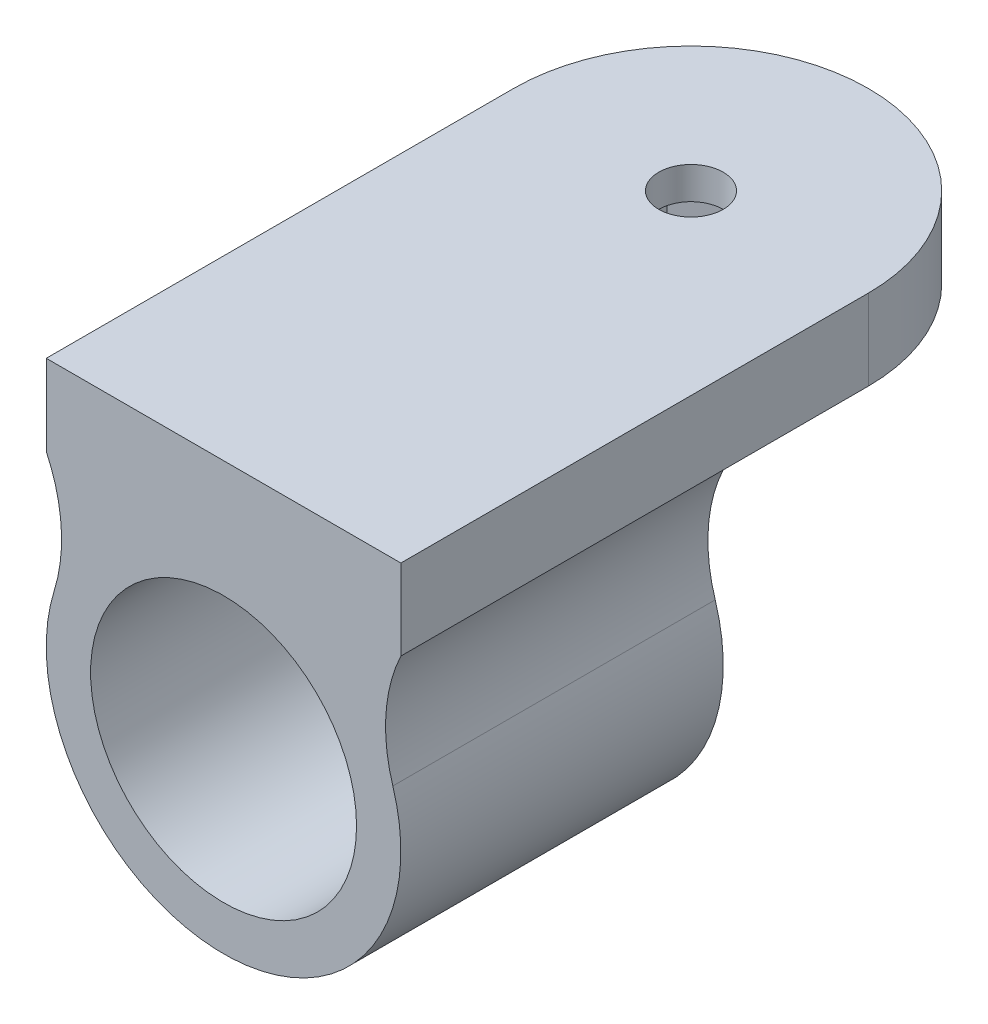
ISO-10303-21;
HEADER;
FILE_DESCRIPTION(('STEP AP214'),'2;1');
FILE_NAME('part.step','',(''),(''),'','','');
FILE_SCHEMA(('AUTOMOTIVE_DESIGN { 1 0 10303 214 1 1 1 1 }'));
ENDSEC;
DATA;
#1=APPLICATION_CONTEXT('core data for automotive mechanical design processes');
#2=APPLICATION_PROTOCOL_DEFINITION('international standard','automotive_design',2000,#1);
#3=PRODUCT_CONTEXT('',#1,'mechanical');
#4=PRODUCT('Part','Part','',(#3));
#5=PRODUCT_RELATED_PRODUCT_CATEGORY('part','',(#4));
#6=PRODUCT_DEFINITION_FORMATION('','',#4);
#7=PRODUCT_DEFINITION_CONTEXT('part definition',#1,'design');
#8=PRODUCT_DEFINITION('design','',#6,#7);
#9=PRODUCT_DEFINITION_SHAPE('','',#8);
#10=(LENGTH_UNIT() NAMED_UNIT(*) SI_UNIT(.MILLI.,.METRE.));
#11=(NAMED_UNIT(*) PLANE_ANGLE_UNIT() SI_UNIT($,.RADIAN.));
#12=(NAMED_UNIT(*) SI_UNIT($,.STERADIAN.) SOLID_ANGLE_UNIT());
#13=UNCERTAINTY_MEASURE_WITH_UNIT(LENGTH_MEASURE(1.E-05),#10,'distance_accuracy_value','');
#14=(GEOMETRIC_REPRESENTATION_CONTEXT(3) GLOBAL_UNCERTAINTY_ASSIGNED_CONTEXT((#13)) GLOBAL_UNIT_ASSIGNED_CONTEXT((#10,
#11,#12)) REPRESENTATION_CONTEXT('',''));
#15=CARTESIAN_POINT('',(0.,0.,0.));
#16=DIRECTION('',(0.,0.,1.));
#17=DIRECTION('',(1.,0.,0.));
#18=AXIS2_PLACEMENT_3D('',#15,#16,#17);
#19=CARTESIAN_POINT('',(0.,15.5,-9.));
#20=DIRECTION('',(0.,-1.,0.));
#21=DIRECTION('',(0.,0.,-1.));
#22=AXIS2_PLACEMENT_3D('',#19,#20,#21);
#23=CYLINDRICAL_SURFACE('',#22,2.);
#24=CARTESIAN_POINT('',(0.,15.5,-9.));
#25=DIRECTION('',(0.,-1.,0.));
#26=DIRECTION('',(0.,0.,-1.));
#27=AXIS2_PLACEMENT_3D('',#24,#25,#26);
#28=CIRCLE('',#27,2.);
#29=CARTESIAN_POINT('',(0.,15.5,-11.));
#30=VERTEX_POINT('',#29);
#31=EDGE_CURVE('E225',#30,#30,#28,.T.);
#32=ORIENTED_EDGE('',*,*,#31,.F.);
#33=EDGE_LOOP('',(#32));
#34=FACE_BOUND('',#33,.T.);
#35=CARTESIAN_POINT('',(0.,13.5,-9.));
#36=DIRECTION('',(0.,-1.,0.));
#37=DIRECTION('',(0.,0.,-1.));
#38=AXIS2_PLACEMENT_3D('',#35,#36,#37);
#39=CIRCLE('',#38,2.);
#40=CARTESIAN_POINT('',(0.,13.5,-11.));
#41=VERTEX_POINT('',#40);
#42=EDGE_CURVE('E47',#41,#41,#39,.F.);
#43=ORIENTED_EDGE('',*,*,#42,.F.);
#44=EDGE_LOOP('',(#43));
#45=FACE_BOUND('',#44,.T.);
#46=ADVANCED_FACE('F43',(#34,#45),#23,.F.);
#47=CARTESIAN_POINT('',(0.,0.,20.));
#48=DIRECTION('',(0.,0.,1.));
#49=DIRECTION('',(1.,0.,0.));
#50=AXIS2_PLACEMENT_3D('',#47,#48,#49);
#51=PLANE('',#50);
#52=DIRECTION('',(0.,-1.,0.));
#53=VECTOR('',#52,1.);
#54=CARTESIAN_POINT('',(-11.,15.5,20.));
#55=LINE('',#54,#53);
#56=CARTESIAN_POINT('',(-11.,15.5,20.));
#57=VERTEX_POINT('',#56);
#58=CARTESIAN_POINT('',(-11.,10.5,20.));
#59=VERTEX_POINT('',#58);
#60=EDGE_CURVE('E252',#57,#59,#55,.T.);
#61=ORIENTED_EDGE('',*,*,#60,.T.);
#62=CARTESIAN_POINT('',(-20.0497964461891,6.24545134208765,20.));
#63=DIRECTION('',(0.,0.,1.));
#64=DIRECTION('',(1.,0.,0.));
#65=AXIS2_PLACEMENT_3D('',#62,#63,#64);
#66=CIRCLE('',#65,10.);
#67=CARTESIAN_POINT('',(-10.5022743289562,3.27142689347448,20.));
#68=VERTEX_POINT('',#67);
#69=EDGE_CURVE('E53',#59,#68,#66,.F.);
#70=ORIENTED_EDGE('',*,*,#69,.T.);
#71=CARTESIAN_POINT('',(0.,0.,20.));
#72=DIRECTION('',(0.,0.,1.));
#73=DIRECTION('',(1.,0.,0.));
#74=AXIS2_PLACEMENT_3D('',#71,#72,#73);
#75=CIRCLE('',#74,11.);
#76=CARTESIAN_POINT('',(10.5022743289562,3.27142689347448,20.));
#77=VERTEX_POINT('',#76);
#78=EDGE_CURVE('E267',#68,#77,#75,.T.);
#79=ORIENTED_EDGE('',*,*,#78,.T.);
#80=CARTESIAN_POINT('',(20.0497964461891,6.24545134208765,20.));
#81=DIRECTION('',(0.,0.,1.));
#82=DIRECTION('',(1.,0.,0.));
#83=AXIS2_PLACEMENT_3D('',#80,#81,#82);
#84=CIRCLE('',#83,10.);
#85=CARTESIAN_POINT('',(11.,10.5,20.));
#86=VERTEX_POINT('',#85);
#87=EDGE_CURVE('E282',#77,#86,#84,.F.);
#88=ORIENTED_EDGE('',*,*,#87,.T.);
#89=DIRECTION('',(0.,-1.,0.));
#90=VECTOR('',#89,1.);
#91=CARTESIAN_POINT('',(11.,15.5,20.));
#92=LINE('',#91,#90);
#93=CARTESIAN_POINT('',(11.,15.5,20.));
#94=VERTEX_POINT('',#93);
#95=EDGE_CURVE('E241',#94,#86,#92,.T.);
#96=ORIENTED_EDGE('',*,*,#95,.F.);
#97=DIRECTION('',(1.,0.,0.));
#98=VECTOR('',#97,1.);
#99=CARTESIAN_POINT('',(-11.,15.5,20.));
#100=LINE('',#99,#98);
#101=EDGE_CURVE('E233',#57,#94,#100,.T.);
#102=ORIENTED_EDGE('',*,*,#101,.F.);
#103=EDGE_LOOP('',(#61,#70,#79,#88,#96,#102));
#104=FACE_BOUND('',#103,.T.);
#105=CARTESIAN_POINT('',(0.,0.,20.));
#106=DIRECTION('',(0.,0.,1.));
#107=DIRECTION('',(1.,0.,0.));
#108=AXIS2_PLACEMENT_3D('',#105,#106,#107);
#109=CIRCLE('',#108,8.25);
#110=CARTESIAN_POINT('',(8.25,0.,20.));
#111=VERTEX_POINT('',#110);
#112=EDGE_CURVE('E259',#111,#111,#109,.T.);
#113=ORIENTED_EDGE('',*,*,#112,.F.);
#114=EDGE_LOOP('',(#113));
#115=FACE_BOUND('',#114,.T.);
#116=ADVANCED_FACE('F295',(#104,#115),#51,.T.);
#117=CARTESIAN_POINT('',(0.,0.,0.));
#118=DIRECTION('',(0.,0.,1.));
#119=DIRECTION('',(1.,0.,0.));
#120=AXIS2_PLACEMENT_3D('',#117,#118,#119);
#121=PLANE('',#120);
#122=CARTESIAN_POINT('',(0.,0.,0.));
#123=DIRECTION('',(0.,0.,1.));
#124=DIRECTION('',(1.,0.,0.));
#125=AXIS2_PLACEMENT_3D('',#122,#123,#124);
#126=CIRCLE('',#125,11.);
#127=CARTESIAN_POINT('',(-10.5022743289562,3.27142689347448,0.));
#128=VERTEX_POINT('',#127);
#129=CARTESIAN_POINT('',(10.5022743289562,3.27142689347448,0.));
#130=VERTEX_POINT('',#129);
#131=EDGE_CURVE('E263',#128,#130,#126,.T.);
#132=ORIENTED_EDGE('',*,*,#131,.F.);
#133=CARTESIAN_POINT('',(-20.0497964461891,6.24545134208765,0.));
#134=DIRECTION('',(0.,0.,1.));
#135=DIRECTION('',(1.,0.,0.));
#136=AXIS2_PLACEMENT_3D('',#133,#134,#135);
#137=CIRCLE('',#136,10.);
#138=CARTESIAN_POINT('',(-11.,10.5,0.));
#139=VERTEX_POINT('',#138);
#140=EDGE_CURVE('E288',#128,#139,#137,.T.);
#141=ORIENTED_EDGE('',*,*,#140,.T.);
#142=DIRECTION('',(1.,0.,0.));
#143=VECTOR('',#142,1.);
#144=CARTESIAN_POINT('',(0.,10.5,0.));
#145=LINE('',#144,#143);
#146=CARTESIAN_POINT('',(11.,10.5,0.));
#147=VERTEX_POINT('',#146);
#148=EDGE_CURVE('E68',#139,#147,#145,.T.);
#149=ORIENTED_EDGE('',*,*,#148,.T.);
#150=CARTESIAN_POINT('',(20.0497964461891,6.24545134208765,0.));
#151=DIRECTION('',(0.,0.,1.));
#152=DIRECTION('',(1.,0.,0.));
#153=AXIS2_PLACEMENT_3D('',#150,#151,#152);
#154=CIRCLE('',#153,10.);
#155=EDGE_CURVE('E285',#147,#130,#154,.T.);
#156=ORIENTED_EDGE('',*,*,#155,.T.);
#157=EDGE_LOOP('',(#132,#141,#149,#156));
#158=FACE_BOUND('',#157,.T.);
#159=CARTESIAN_POINT('',(0.,0.,0.));
#160=DIRECTION('',(0.,0.,1.));
#161=DIRECTION('',(1.,0.,0.));
#162=AXIS2_PLACEMENT_3D('',#159,#160,#161);
#163=CIRCLE('',#162,8.25);
#164=CARTESIAN_POINT('',(8.25,0.,0.));
#165=VERTEX_POINT('',#164);
#166=EDGE_CURVE('E258',#165,#165,#163,.T.);
#167=ORIENTED_EDGE('',*,*,#166,.T.);
#168=EDGE_LOOP('',(#167));
#169=FACE_BOUND('',#168,.T.);
#170=ADVANCED_FACE('F306',(#158,#169),#121,.F.);
#171=CARTESIAN_POINT('',(0.,0.,20.));
#172=DIRECTION('',(0.,0.,-1.));
#173=DIRECTION('',(-1.,0.,0.));
#174=AXIS2_PLACEMENT_3D('',#171,#172,#173);
#175=CYLINDRICAL_SURFACE('',#174,11.);
#176=ORIENTED_EDGE('',*,*,#131,.T.);
#177=DIRECTION('',(0.,0.,-1.));
#178=VECTOR('',#177,1.);
#179=CARTESIAN_POINT('',(10.5022743289562,3.27142689347448,20.));
#180=LINE('',#179,#178);
#181=EDGE_CURVE('E278',#130,#77,#180,.F.);
#182=ORIENTED_EDGE('',*,*,#181,.T.);
#183=ORIENTED_EDGE('',*,*,#78,.F.);
#184=DIRECTION('',(0.,0.,-1.));
#185=VECTOR('',#184,1.);
#186=CARTESIAN_POINT('',(-10.5022743289562,3.27142689347448,20.));
#187=LINE('',#186,#185);
#188=EDGE_CURVE('E271',#68,#128,#187,.T.);
#189=ORIENTED_EDGE('',*,*,#188,.T.);
#190=EDGE_LOOP('',(#176,#182,#183,#189));
#191=FACE_BOUND('',#190,.T.);
#192=ADVANCED_FACE('F303',(#191),#175,.T.);
#193=CARTESIAN_POINT('',(0.,0.,20.));
#194=DIRECTION('',(0.,0.,-1.));
#195=DIRECTION('',(-1.,0.,0.));
#196=AXIS2_PLACEMENT_3D('',#193,#194,#195);
#197=CYLINDRICAL_SURFACE('',#196,8.25);
#198=ORIENTED_EDGE('',*,*,#112,.T.);
#199=EDGE_LOOP('',(#198));
#200=FACE_BOUND('',#199,.T.);
#201=ORIENTED_EDGE('',*,*,#166,.F.);
#202=EDGE_LOOP('',(#201));
#203=FACE_BOUND('',#202,.T.);
#204=ADVANCED_FACE('F348',(#200,#203),#197,.F.);
#205=CARTESIAN_POINT('',(0.,10.5,0.));
#206=DIRECTION('',(0.,-1.,0.));
#207=DIRECTION('',(0.,0.,-1.));
#208=AXIS2_PLACEMENT_3D('',#205,#206,#207);
#209=PLANE('',#208);
#210=DIRECTION('',(0.,0.,1.));
#211=VECTOR('',#210,1.);
#212=CARTESIAN_POINT('',(3.5,10.5,-11.0207259421637));
#213=LINE('',#212,#211);
#214=CARTESIAN_POINT('',(3.5,10.5,-11.0207259421637));
#215=VERTEX_POINT('',#214);
#216=CARTESIAN_POINT('',(3.5,10.5,-6.97927405783631));
#217=VERTEX_POINT('',#216);
#218=EDGE_CURVE('E60',#215,#217,#213,.T.);
#219=ORIENTED_EDGE('',*,*,#218,.F.);
#220=DIRECTION('',(0.866025403784439,0.,0.5));
#221=VECTOR('',#220,1.);
#222=CARTESIAN_POINT('',(0.,10.5,-13.0414518843274));
#223=LINE('',#222,#221);
#224=CARTESIAN_POINT('',(0.,10.5,-13.0414518843274));
#225=VERTEX_POINT('',#224);
#226=EDGE_CURVE('E166',#225,#215,#223,.T.);
#227=ORIENTED_EDGE('',*,*,#226,.F.);
#228=DIRECTION('',(0.866025403784438,0.,-0.5));
#229=VECTOR('',#228,1.);
#230=CARTESIAN_POINT('',(-3.5,10.5,-11.0207259421637));
#231=LINE('',#230,#229);
#232=CARTESIAN_POINT('',(-3.5,10.5,-11.0207259421637));
#233=VERTEX_POINT('',#232);
#234=EDGE_CURVE('E170',#233,#225,#231,.T.);
#235=ORIENTED_EDGE('',*,*,#234,.F.);
#236=DIRECTION('',(0.,0.,-1.));
#237=VECTOR('',#236,1.);
#238=CARTESIAN_POINT('',(-3.5,10.5,-6.97927405783631));
#239=LINE('',#238,#237);
#240=CARTESIAN_POINT('',(-3.5,10.5,-6.97927405783631));
#241=VERTEX_POINT('',#240);
#242=EDGE_CURVE('E193',#241,#233,#239,.T.);
#243=ORIENTED_EDGE('',*,*,#242,.F.);
#244=DIRECTION('',(-0.866025403784439,0.,-0.5));
#245=VECTOR('',#244,1.);
#246=CARTESIAN_POINT('',(0.,10.5,-4.95854811567262));
#247=LINE('',#246,#245);
#248=CARTESIAN_POINT('',(0.,10.5,-4.95854811567262));
#249=VERTEX_POINT('',#248);
#250=EDGE_CURVE('E189',#249,#241,#247,.T.);
#251=ORIENTED_EDGE('',*,*,#250,.F.);
#252=DIRECTION('',(-0.866025403784439,0.,0.5));
#253=VECTOR('',#252,1.);
#254=CARTESIAN_POINT('',(3.5,10.5,-6.97927405783631));
#255=LINE('',#254,#253);
#256=EDGE_CURVE('E186',#217,#249,#255,.T.);
#257=ORIENTED_EDGE('',*,*,#256,.F.);
#258=EDGE_LOOP('',(#219,#227,#235,#243,#251,#257));
#259=FACE_BOUND('',#258,.T.);
#260=CARTESIAN_POINT('',(0.,10.5,-9.));
#261=DIRECTION('',(0.,1.,0.));
#262=DIRECTION('',(0.,0.,-1.));
#263=AXIS2_PLACEMENT_3D('',#260,#261,#262);
#264=CIRCLE('',#263,11.);
#265=CARTESIAN_POINT('',(11.,10.5,-9.));
#266=VERTEX_POINT('',#265);
#267=CARTESIAN_POINT('',(-11.,10.5,-9.));
#268=VERTEX_POINT('',#267);
#269=EDGE_CURVE('E218',#266,#268,#264,.T.);
#270=ORIENTED_EDGE('',*,*,#269,.F.);
#271=DIRECTION('',(0.,0.,-1.));
#272=VECTOR('',#271,1.);
#273=CARTESIAN_POINT('',(11.,10.5,20.));
#274=LINE('',#273,#272);
#275=EDGE_CURVE('E245',#147,#266,#274,.T.);
#276=ORIENTED_EDGE('',*,*,#275,.F.);
#277=ORIENTED_EDGE('',*,*,#148,.F.);
#278=DIRECTION('',(0.,0.,1.));
#279=VECTOR('',#278,1.);
#280=CARTESIAN_POINT('',(-11.,10.5,20.));
#281=LINE('',#280,#279);
#282=EDGE_CURVE('E242',#268,#139,#281,.T.);
#283=ORIENTED_EDGE('',*,*,#282,.F.);
#284=EDGE_LOOP('',(#270,#276,#277,#283));
#285=FACE_BOUND('',#284,.T.);
#286=ADVANCED_FACE('F345',(#259,#285),#209,.T.);
#287=CARTESIAN_POINT('',(-11.,15.5,20.));
#288=DIRECTION('',(1.,0.,0.));
#289=DIRECTION('',(0.,0.,-1.));
#290=AXIS2_PLACEMENT_3D('',#287,#288,#289);
#291=PLANE('',#290);
#292=DIRECTION('',(0.,0.,1.));
#293=VECTOR('',#292,1.);
#294=CARTESIAN_POINT('',(-11.,15.5,20.));
#295=LINE('',#294,#293);
#296=CARTESIAN_POINT('',(-11.,15.5,-9.));
#297=VERTEX_POINT('',#296);
#298=EDGE_CURVE('E230',#297,#57,#295,.T.);
#299=ORIENTED_EDGE('',*,*,#298,.F.);
#300=DIRECTION('',(0.,-1.,0.));
#301=VECTOR('',#300,1.);
#302=CARTESIAN_POINT('',(-11.,15.5,-9.));
#303=LINE('',#302,#301);
#304=EDGE_CURVE('E214',#297,#268,#303,.T.);
#305=ORIENTED_EDGE('',*,*,#304,.T.);
#306=ORIENTED_EDGE('',*,*,#282,.T.);
#307=EDGE_CURVE('E229',#139,#59,#281,.T.);
#308=ORIENTED_EDGE('',*,*,#307,.T.);
#309=ORIENTED_EDGE('',*,*,#60,.F.);
#310=EDGE_LOOP('',(#299,#305,#306,#308,#309));
#311=FACE_BOUND('',#310,.T.);
#312=ADVANCED_FACE('F322',(#311),#291,.F.);
#313=CARTESIAN_POINT('',(11.,15.5,20.));
#314=DIRECTION('',(-1.,0.,0.));
#315=DIRECTION('',(0.,0.,1.));
#316=AXIS2_PLACEMENT_3D('',#313,#314,#315);
#317=PLANE('',#316);
#318=ORIENTED_EDGE('',*,*,#275,.T.);
#319=DIRECTION('',(0.,-1.,0.));
#320=VECTOR('',#319,1.);
#321=CARTESIAN_POINT('',(11.,15.5,-9.));
#322=LINE('',#321,#320);
#323=CARTESIAN_POINT('',(11.,15.5,-9.));
#324=VERTEX_POINT('',#323);
#325=EDGE_CURVE('E219',#324,#266,#322,.T.);
#326=ORIENTED_EDGE('',*,*,#325,.F.);
#327=DIRECTION('',(0.,0.,-1.));
#328=VECTOR('',#327,1.);
#329=CARTESIAN_POINT('',(11.,15.5,20.));
#330=LINE('',#329,#328);
#331=EDGE_CURVE('E237',#94,#324,#330,.T.);
#332=ORIENTED_EDGE('',*,*,#331,.F.);
#333=ORIENTED_EDGE('',*,*,#95,.T.);
#334=EDGE_CURVE('E234',#86,#147,#274,.T.);
#335=ORIENTED_EDGE('',*,*,#334,.T.);
#336=EDGE_LOOP('',(#318,#326,#332,#333,#335));
#337=FACE_BOUND('',#336,.T.);
#338=ADVANCED_FACE('F316',(#337),#317,.F.);
#339=CARTESIAN_POINT('',(0.,15.5,0.));
#340=DIRECTION('',(0.,-1.,0.));
#341=DIRECTION('',(0.,0.,-1.));
#342=AXIS2_PLACEMENT_3D('',#339,#340,#341);
#343=PLANE('',#342);
#344=ORIENTED_EDGE('',*,*,#31,.T.);
#345=EDGE_LOOP('',(#344));
#346=FACE_BOUND('',#345,.T.);
#347=ORIENTED_EDGE('',*,*,#331,.T.);
#348=CARTESIAN_POINT('',(0.,15.5,-9.));
#349=DIRECTION('',(0.,-1.,0.));
#350=DIRECTION('',(0.,0.,-1.));
#351=AXIS2_PLACEMENT_3D('',#348,#349,#350);
#352=CIRCLE('',#351,11.);
#353=EDGE_CURVE('E11',#324,#297,#352,.F.);
#354=ORIENTED_EDGE('',*,*,#353,.T.);
#355=ORIENTED_EDGE('',*,*,#298,.T.);
#356=ORIENTED_EDGE('',*,*,#101,.T.);
#357=EDGE_LOOP('',(#347,#354,#355,#356));
#358=FACE_BOUND('',#357,.T.);
#359=ADVANCED_FACE('F319',(#346,#358),#343,.F.);
#360=CARTESIAN_POINT('',(20.0497964461891,6.24545134208765,0.));
#361=DIRECTION('',(0.,0.,-1.));
#362=DIRECTION('',(-1.,0.,0.));
#363=AXIS2_PLACEMENT_3D('',#360,#361,#362);
#364=CYLINDRICAL_SURFACE('',#363,10.);
#365=ORIENTED_EDGE('',*,*,#155,.F.);
#366=ORIENTED_EDGE('',*,*,#334,.F.);
#367=ORIENTED_EDGE('',*,*,#87,.F.);
#368=ORIENTED_EDGE('',*,*,#181,.F.);
#369=EDGE_LOOP('',(#365,#366,#367,#368));
#370=FACE_BOUND('',#369,.T.);
#371=ADVANCED_FACE('F310',(#370),#364,.F.);
#372=CARTESIAN_POINT('',(-20.0497964461891,6.24545134208765,0.));
#373=DIRECTION('',(0.,0.,1.));
#374=DIRECTION('',(1.,0.,0.));
#375=AXIS2_PLACEMENT_3D('',#372,#373,#374);
#376=CYLINDRICAL_SURFACE('',#375,10.);
#377=ORIENTED_EDGE('',*,*,#69,.F.);
#378=ORIENTED_EDGE('',*,*,#307,.F.);
#379=ORIENTED_EDGE('',*,*,#140,.F.);
#380=ORIENTED_EDGE('',*,*,#188,.F.);
#381=EDGE_LOOP('',(#377,#378,#379,#380));
#382=FACE_BOUND('',#381,.T.);
#383=ADVANCED_FACE('F45',(#382),#376,.F.);
#384=CARTESIAN_POINT('',(0.,15.5,-9.));
#385=DIRECTION('',(0.,-1.,0.));
#386=DIRECTION('',(0.,0.,-1.));
#387=AXIS2_PLACEMENT_3D('',#384,#385,#386);
#388=CYLINDRICAL_SURFACE('',#387,11.);
#389=ORIENTED_EDGE('',*,*,#269,.T.);
#390=ORIENTED_EDGE('',*,*,#304,.F.);
#391=ORIENTED_EDGE('',*,*,#353,.F.);
#392=ORIENTED_EDGE('',*,*,#325,.T.);
#393=EDGE_LOOP('',(#389,#390,#391,#392));
#394=FACE_BOUND('',#393,.T.);
#395=ADVANCED_FACE('F340',(#394),#388,.T.);
#396=CARTESIAN_POINT('',(0.,13.5,0.));
#397=DIRECTION('',(0.,-1.,0.));
#398=DIRECTION('',(0.,0.,-1.));
#399=AXIS2_PLACEMENT_3D('',#396,#397,#398);
#400=PLANE('',#399);
#401=DIRECTION('',(0.,0.,1.));
#402=VECTOR('',#401,1.);
#403=CARTESIAN_POINT('',(3.5,13.5,-11.0207259421637));
#404=LINE('',#403,#402);
#405=CARTESIAN_POINT('',(3.5,13.5,-11.0207259421637));
#406=VERTEX_POINT('',#405);
#407=CARTESIAN_POINT('',(3.5,13.5,-6.97927405783631));
#408=VERTEX_POINT('',#407);
#409=EDGE_CURVE('E143',#406,#408,#404,.T.);
#410=ORIENTED_EDGE('',*,*,#409,.T.);
#411=DIRECTION('',(-0.866025403784439,0.,0.5));
#412=VECTOR('',#411,1.);
#413=CARTESIAN_POINT('',(3.5,13.5,-6.97927405783631));
#414=LINE('',#413,#412);
#415=CARTESIAN_POINT('',(0.,13.5,-4.95854811567262));
#416=VERTEX_POINT('',#415);
#417=EDGE_CURVE('E153',#408,#416,#414,.T.);
#418=ORIENTED_EDGE('',*,*,#417,.T.);
#419=DIRECTION('',(-0.866025403784439,0.,-0.5));
#420=VECTOR('',#419,1.);
#421=CARTESIAN_POINT('',(0.,13.5,-4.95854811567262));
#422=LINE('',#421,#420);
#423=CARTESIAN_POINT('',(-3.5,13.5,-6.97927405783631));
#424=VERTEX_POINT('',#423);
#425=EDGE_CURVE('E159',#416,#424,#422,.T.);
#426=ORIENTED_EDGE('',*,*,#425,.T.);
#427=DIRECTION('',(0.,0.,-1.));
#428=VECTOR('',#427,1.);
#429=CARTESIAN_POINT('',(-3.5,13.5,-6.97927405783631));
#430=LINE('',#429,#428);
#431=CARTESIAN_POINT('',(-3.5,13.5,-11.0207259421637));
#432=VERTEX_POINT('',#431);
#433=EDGE_CURVE('E175',#424,#432,#430,.T.);
#434=ORIENTED_EDGE('',*,*,#433,.T.);
#435=DIRECTION('',(0.866025403784438,0.,-0.5));
#436=VECTOR('',#435,1.);
#437=CARTESIAN_POINT('',(-3.5,13.5,-11.0207259421637));
#438=LINE('',#437,#436);
#439=CARTESIAN_POINT('',(0.,13.5,-13.0414518843274));
#440=VERTEX_POINT('',#439);
#441=EDGE_CURVE('E179',#432,#440,#438,.T.);
#442=ORIENTED_EDGE('',*,*,#441,.T.);
#443=DIRECTION('',(0.866025403784439,0.,0.5));
#444=VECTOR('',#443,1.);
#445=CARTESIAN_POINT('',(0.,13.5,-13.0414518843274));
#446=LINE('',#445,#444);
#447=EDGE_CURVE('E150',#440,#406,#446,.T.);
#448=ORIENTED_EDGE('',*,*,#447,.T.);
#449=EDGE_LOOP('',(#410,#418,#426,#434,#442,#448));
#450=FACE_BOUND('',#449,.T.);
#451=ORIENTED_EDGE('',*,*,#42,.T.);
#452=EDGE_LOOP('',(#451));
#453=FACE_BOUND('',#452,.T.);
#454=ADVANCED_FACE('F161',(#450,#453),#400,.T.);
#455=CARTESIAN_POINT('',(3.5,13.5,-11.0207259421637));
#456=DIRECTION('',(1.,0.,0.));
#457=DIRECTION('',(0.,0.,-1.));
#458=AXIS2_PLACEMENT_3D('',#455,#456,#457);
#459=PLANE('',#458);
#460=ORIENTED_EDGE('',*,*,#218,.T.);
#461=DIRECTION('',(0.,-1.,0.));
#462=VECTOR('',#461,1.);
#463=CARTESIAN_POINT('',(3.5,13.5,-6.97927405783631));
#464=LINE('',#463,#462);
#465=EDGE_CURVE('E139',#408,#217,#464,.T.);
#466=ORIENTED_EDGE('',*,*,#465,.F.);
#467=ORIENTED_EDGE('',*,*,#409,.F.);
#468=DIRECTION('',(0.,-1.,0.));
#469=VECTOR('',#468,1.);
#470=CARTESIAN_POINT('',(3.5,13.5,-11.0207259421637));
#471=LINE('',#470,#469);
#472=EDGE_CURVE('E200',#406,#215,#471,.T.);
#473=ORIENTED_EDGE('',*,*,#472,.T.);
#474=EDGE_LOOP('',(#460,#466,#467,#473));
#475=FACE_BOUND('',#474,.T.);
#476=ADVANCED_FACE('F141',(#475),#459,.F.);
#477=CARTESIAN_POINT('',(0.,13.5,-13.0414518843274));
#478=DIRECTION('',(0.5,0.,-0.866025403784439));
#479=DIRECTION('',(-0.866025403784439,0.,-0.5));
#480=AXIS2_PLACEMENT_3D('',#477,#478,#479);
#481=PLANE('',#480);
#482=ORIENTED_EDGE('',*,*,#226,.T.);
#483=ORIENTED_EDGE('',*,*,#472,.F.);
#484=ORIENTED_EDGE('',*,*,#447,.F.);
#485=DIRECTION('',(0.,-1.,0.));
#486=VECTOR('',#485,1.);
#487=CARTESIAN_POINT('',(0.,13.5,-13.0414518843274));
#488=LINE('',#487,#486);
#489=EDGE_CURVE('E203',#440,#225,#488,.T.);
#490=ORIENTED_EDGE('',*,*,#489,.T.);
#491=EDGE_LOOP('',(#482,#483,#484,#490));
#492=FACE_BOUND('',#491,.T.);
#493=ADVANCED_FACE('F376',(#492),#481,.F.);
#494=CARTESIAN_POINT('',(-3.5,13.5,-11.0207259421637));
#495=DIRECTION('',(-0.5,0.,-0.866025403784439));
#496=DIRECTION('',(-0.866025403784439,0.,0.5));
#497=AXIS2_PLACEMENT_3D('',#494,#495,#496);
#498=PLANE('',#497);
#499=ORIENTED_EDGE('',*,*,#234,.T.);
#500=ORIENTED_EDGE('',*,*,#489,.F.);
#501=ORIENTED_EDGE('',*,*,#441,.F.);
#502=DIRECTION('',(0.,-1.,0.));
#503=VECTOR('',#502,1.);
#504=CARTESIAN_POINT('',(-3.5,13.5,-11.0207259421637));
#505=LINE('',#504,#503);
#506=EDGE_CURVE('E206',#432,#233,#505,.T.);
#507=ORIENTED_EDGE('',*,*,#506,.T.);
#508=EDGE_LOOP('',(#499,#500,#501,#507));
#509=FACE_BOUND('',#508,.T.);
#510=ADVANCED_FACE('F380',(#509),#498,.F.);
#511=CARTESIAN_POINT('',(-3.5,13.5,-6.97927405783631));
#512=DIRECTION('',(-1.,0.,0.));
#513=DIRECTION('',(0.,0.,1.));
#514=AXIS2_PLACEMENT_3D('',#511,#512,#513);
#515=PLANE('',#514);
#516=ORIENTED_EDGE('',*,*,#242,.T.);
#517=ORIENTED_EDGE('',*,*,#506,.F.);
#518=ORIENTED_EDGE('',*,*,#433,.F.);
#519=DIRECTION('',(0.,-1.,0.));
#520=VECTOR('',#519,1.);
#521=CARTESIAN_POINT('',(-3.5,13.5,-6.97927405783631));
#522=LINE('',#521,#520);
#523=EDGE_CURVE('E209',#424,#241,#522,.T.);
#524=ORIENTED_EDGE('',*,*,#523,.T.);
#525=EDGE_LOOP('',(#516,#517,#518,#524));
#526=FACE_BOUND('',#525,.T.);
#527=ADVANCED_FACE('F384',(#526),#515,.F.);
#528=CARTESIAN_POINT('',(0.,13.5,-4.95854811567262));
#529=DIRECTION('',(-0.5,0.,0.866025403784439));
#530=DIRECTION('',(0.866025403784439,0.,0.5));
#531=AXIS2_PLACEMENT_3D('',#528,#529,#530);
#532=PLANE('',#531);
#533=ORIENTED_EDGE('',*,*,#250,.T.);
#534=ORIENTED_EDGE('',*,*,#523,.F.);
#535=ORIENTED_EDGE('',*,*,#425,.F.);
#536=DIRECTION('',(0.,-1.,0.));
#537=VECTOR('',#536,1.);
#538=CARTESIAN_POINT('',(0.,13.5,-4.95854811567262));
#539=LINE('',#538,#537);
#540=EDGE_CURVE('E149',#416,#249,#539,.T.);
#541=ORIENTED_EDGE('',*,*,#540,.T.);
#542=EDGE_LOOP('',(#533,#534,#535,#541));
#543=FACE_BOUND('',#542,.T.);
#544=ADVANCED_FACE('F388',(#543),#532,.F.);
#545=CARTESIAN_POINT('',(3.5,13.5,-6.97927405783631));
#546=DIRECTION('',(0.5,0.,0.866025403784439));
#547=DIRECTION('',(0.866025403784439,0.,-0.5));
#548=AXIS2_PLACEMENT_3D('',#545,#546,#547);
#549=PLANE('',#548);
#550=ORIENTED_EDGE('',*,*,#256,.T.);
#551=ORIENTED_EDGE('',*,*,#540,.F.);
#552=ORIENTED_EDGE('',*,*,#417,.F.);
#553=ORIENTED_EDGE('',*,*,#465,.T.);
#554=EDGE_LOOP('',(#550,#551,#552,#553));
#555=FACE_BOUND('',#554,.T.);
#556=ADVANCED_FACE('F154',(#555),#549,.F.);
#557=CLOSED_SHELL('',(#46,#116,#170,#192,#204,#286,#312,#338,#359,#371,#383,#395,#454,#476,#493,
#510,#527,#544,#556));
#558=MANIFOLD_SOLID_BREP('B2',#557);
#559=ADVANCED_BREP_SHAPE_REPRESENTATION('',(#18,#558),#14);
#560=SHAPE_DEFINITION_REPRESENTATION(#9,#559);
ENDSEC;
END-ISO-10303-21;
